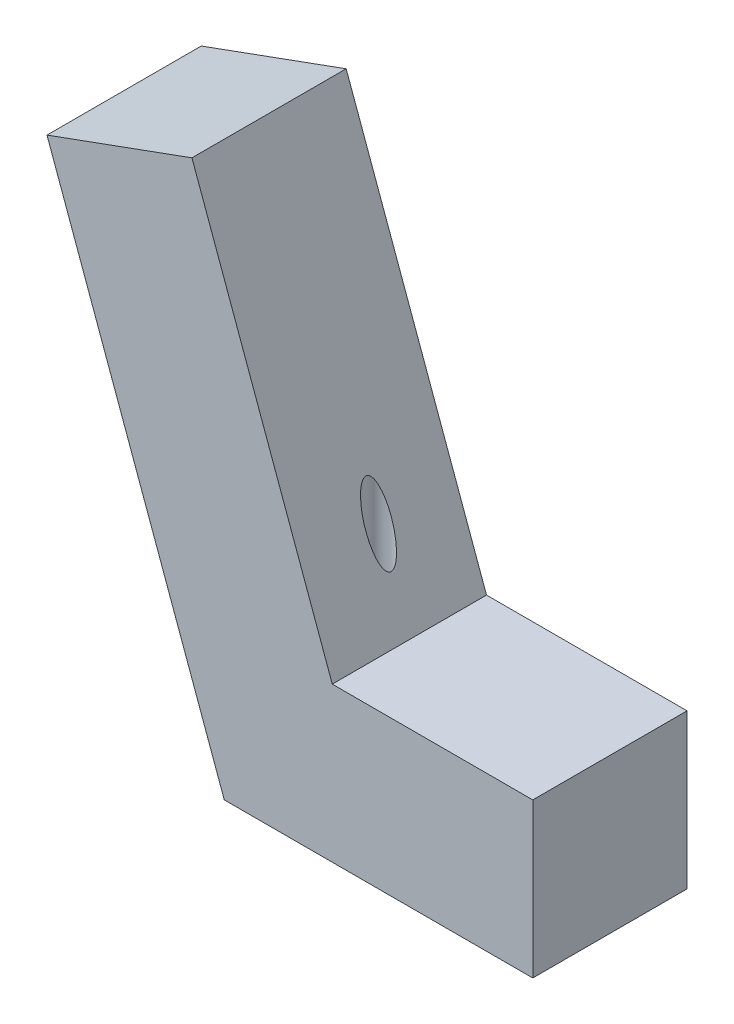
ISO-10303-21;
HEADER;
FILE_DESCRIPTION(('STEP AP214'),'2;1');
FILE_NAME('part.step','',(''),(''),'','','');
FILE_SCHEMA(('AUTOMOTIVE_DESIGN { 1 0 10303 214 1 1 1 1 }'));
ENDSEC;
DATA;
#1=APPLICATION_CONTEXT('core data for automotive mechanical design processes');
#2=APPLICATION_PROTOCOL_DEFINITION('international standard','automotive_design',2000,#1);
#3=PRODUCT_CONTEXT('',#1,'mechanical');
#4=PRODUCT('Part','Part','',(#3));
#5=PRODUCT_RELATED_PRODUCT_CATEGORY('part','',(#4));
#6=PRODUCT_DEFINITION_FORMATION('','',#4);
#7=PRODUCT_DEFINITION_CONTEXT('part definition',#1,'design');
#8=PRODUCT_DEFINITION('design','',#6,#7);
#9=PRODUCT_DEFINITION_SHAPE('','',#8);
#10=(LENGTH_UNIT() NAMED_UNIT(*) SI_UNIT(.MILLI.,.METRE.));
#11=(NAMED_UNIT(*) PLANE_ANGLE_UNIT() SI_UNIT($,.RADIAN.));
#12=(NAMED_UNIT(*) SI_UNIT($,.STERADIAN.) SOLID_ANGLE_UNIT());
#13=UNCERTAINTY_MEASURE_WITH_UNIT(LENGTH_MEASURE(1.E-05),#10,'distance_accuracy_value','');
#14=(GEOMETRIC_REPRESENTATION_CONTEXT(3) GLOBAL_UNCERTAINTY_ASSIGNED_CONTEXT((#13)) GLOBAL_UNIT_ASSIGNED_CONTEXT((#10,
#11,#12)) REPRESENTATION_CONTEXT('',''));
#15=CARTESIAN_POINT('',(0.,0.,0.));
#16=DIRECTION('',(0.,0.,1.));
#17=DIRECTION('',(1.,0.,0.));
#18=AXIS2_PLACEMENT_3D('',#15,#16,#17);
#19=CARTESIAN_POINT('',(60.0448439503615,-25.4,25.4));
#20=DIRECTION('',(0.,1.,0.));
#21=DIRECTION('',(0.,0.,1.));
#22=AXIS2_PLACEMENT_3D('',#19,#20,#21);
#23=PLANE('',#22);
#24=CARTESIAN_POINT('',(21.9448439503615,-25.4,12.7));
#25=DIRECTION('',(0.,-1.,0.));
#26=DIRECTION('',(0.,0.,-1.));
#27=AXIS2_PLACEMENT_3D('',#24,#25,#26);
#28=CIRCLE('',#27,6.35);
#29=CARTESIAN_POINT('',(21.9448439503615,-25.4,6.34999999999999));
#30=VERTEX_POINT('',#29);
#31=EDGE_CURVE('E146',#30,#30,#28,.T.);
#32=ORIENTED_EDGE('',*,*,#31,.F.);
#33=EDGE_LOOP('',(#32));
#34=FACE_BOUND('',#33,.T.);
#35=DIRECTION('',(1.,0.,0.));
#36=VECTOR('',#35,1.);
#37=CARTESIAN_POINT('',(60.0448439503615,-25.4,0.));
#38=LINE('',#37,#36);
#39=CARTESIAN_POINT('',(9.24484395036146,-25.4,0.));
#40=VERTEX_POINT('',#39);
#41=CARTESIAN_POINT('',(60.0448439503615,-25.4,0.));
#42=VERTEX_POINT('',#41);
#43=EDGE_CURVE('E121',#40,#42,#38,.T.);
#44=ORIENTED_EDGE('',*,*,#43,.T.);
#45=DIRECTION('',(0.,0.,-1.));
#46=VECTOR('',#45,1.);
#47=CARTESIAN_POINT('',(60.0448439503615,-25.4,25.4));
#48=LINE('',#47,#46);
#49=CARTESIAN_POINT('',(60.0448439503615,-25.4,25.4));
#50=VERTEX_POINT('',#49);
#51=EDGE_CURVE('E41',#50,#42,#48,.T.);
#52=ORIENTED_EDGE('',*,*,#51,.F.);
#53=DIRECTION('',(1.,0.,0.));
#54=VECTOR('',#53,1.);
#55=CARTESIAN_POINT('',(60.0448439503615,-25.4,25.4));
#56=LINE('',#55,#54);
#57=CARTESIAN_POINT('',(9.24484395036146,-25.4,25.4));
#58=VERTEX_POINT('',#57);
#59=EDGE_CURVE('E87',#58,#50,#56,.T.);
#60=ORIENTED_EDGE('',*,*,#59,.F.);
#61=DIRECTION('',(0.,0.,-1.));
#62=VECTOR('',#61,1.);
#63=CARTESIAN_POINT('',(9.24484395036146,-25.4,25.4));
#64=LINE('',#63,#62);
#65=EDGE_CURVE('E11',#58,#40,#64,.T.);
#66=ORIENTED_EDGE('',*,*,#65,.T.);
#67=EDGE_LOOP('',(#44,#52,#60,#66));
#68=FACE_BOUND('',#67,.T.);
#69=ADVANCED_FACE('F33',(#34,#68),#23,.F.);
#70=CARTESIAN_POINT('',(60.0448439503614,0.,25.4));
#71=DIRECTION('',(-1.,0.,0.));
#72=DIRECTION('',(0.,-1.,0.));
#73=AXIS2_PLACEMENT_3D('',#70,#71,#72);
#74=PLANE('',#73);
#75=DIRECTION('',(0.,1.,0.));
#76=VECTOR('',#75,1.);
#77=CARTESIAN_POINT('',(60.0448439503614,0.,0.));
#78=LINE('',#77,#76);
#79=CARTESIAN_POINT('',(60.0448439503614,0.,0.));
#80=VERTEX_POINT('',#79);
#81=EDGE_CURVE('E123',#42,#80,#78,.T.);
#82=ORIENTED_EDGE('',*,*,#81,.T.);
#83=DIRECTION('',(0.,0.,-1.));
#84=VECTOR('',#83,1.);
#85=CARTESIAN_POINT('',(60.0448439503614,0.,25.4));
#86=LINE('',#85,#84);
#87=CARTESIAN_POINT('',(60.0448439503614,0.,25.4));
#88=VERTEX_POINT('',#87);
#89=EDGE_CURVE('E110',#88,#80,#86,.T.);
#90=ORIENTED_EDGE('',*,*,#89,.F.);
#91=DIRECTION('',(0.,1.,0.));
#92=VECTOR('',#91,1.);
#93=CARTESIAN_POINT('',(60.0448439503614,0.,25.4));
#94=LINE('',#93,#92);
#95=EDGE_CURVE('E101',#50,#88,#94,.T.);
#96=ORIENTED_EDGE('',*,*,#95,.F.);
#97=ORIENTED_EDGE('',*,*,#51,.T.);
#98=EDGE_LOOP('',(#82,#90,#96,#97));
#99=FACE_BOUND('',#98,.T.);
#100=ADVANCED_FACE('F136',(#99),#74,.F.);
#101=CARTESIAN_POINT('',(27.0301154208881,0.,25.4));
#102=DIRECTION('',(0.,-1.,0.));
#103=DIRECTION('',(0.,0.,-1.));
#104=AXIS2_PLACEMENT_3D('',#101,#102,#103);
#105=PLANE('',#104);
#106=DIRECTION('',(-1.,0.,0.));
#107=VECTOR('',#106,1.);
#108=CARTESIAN_POINT('',(27.0301154208881,0.,0.));
#109=LINE('',#108,#107);
#110=CARTESIAN_POINT('',(27.0301154208881,0.,0.));
#111=VERTEX_POINT('',#110);
#112=EDGE_CURVE('E109',#80,#111,#109,.T.);
#113=ORIENTED_EDGE('',*,*,#112,.T.);
#114=DIRECTION('',(0.,0.,-1.));
#115=VECTOR('',#114,1.);
#116=CARTESIAN_POINT('',(27.0301154208881,0.,25.4));
#117=LINE('',#116,#115);
#118=CARTESIAN_POINT('',(27.0301154208881,0.,25.4));
#119=VERTEX_POINT('',#118);
#120=EDGE_CURVE('E106',#119,#111,#117,.T.);
#121=ORIENTED_EDGE('',*,*,#120,.F.);
#122=DIRECTION('',(-1.,0.,0.));
#123=VECTOR('',#122,1.);
#124=CARTESIAN_POINT('',(27.0301154208881,0.,25.4));
#125=LINE('',#124,#123);
#126=EDGE_CURVE('E95',#88,#119,#125,.T.);
#127=ORIENTED_EDGE('',*,*,#126,.F.);
#128=ORIENTED_EDGE('',*,*,#89,.T.);
#129=EDGE_LOOP('',(#113,#121,#127,#128));
#130=FACE_BOUND('',#129,.T.);
#131=ADVANCED_FACE('F107',(#130),#105,.F.);
#132=CARTESIAN_POINT('',(3.91800554498446,63.5,25.4));
#133=DIRECTION('',(-0.939692620785909,-0.342020143325666,0.));
#134=DIRECTION('',(0.342020143325666,-0.939692620785909,0.));
#135=AXIS2_PLACEMENT_3D('',#132,#133,#134);
#136=PLANE('',#135);
#137=CARTESIAN_POINT('',(21.9448439503615,13.9716685370689,12.7));
#138=DIRECTION('',(-0.939692620785909,-0.342020143325666,0.));
#139=DIRECTION('',(0.342020143325666,-0.939692620785909,0.));
#140=AXIS2_PLACEMENT_3D('',#137,#138,#139);
#141=ELLIPSE('',#140,6.12683212054179,2.0955);
#142=CARTESIAN_POINT('',(24.0403439503615,8.21432960460172,12.7));
#143=VERTEX_POINT('',#142);
#144=EDGE_CURVE('E149',#143,#143,#141,.T.);
#145=ORIENTED_EDGE('',*,*,#144,.T.);
#146=EDGE_LOOP('',(#145));
#147=FACE_BOUND('',#146,.T.);
#148=DIRECTION('',(-0.342020143325666,0.939692620785909,0.));
#149=VECTOR('',#148,1.);
#150=CARTESIAN_POINT('',(3.91800554498446,63.5,0.));
#151=LINE('',#150,#149);
#152=CARTESIAN_POINT('',(3.91800554498446,63.5,0.));
#153=VERTEX_POINT('',#152);
#154=EDGE_CURVE('E73',#111,#153,#151,.T.);
#155=ORIENTED_EDGE('',*,*,#154,.T.);
#156=DIRECTION('',(0.,0.,-1.));
#157=VECTOR('',#156,1.);
#158=CARTESIAN_POINT('',(3.91800554498446,63.5,25.4));
#159=LINE('',#158,#157);
#160=CARTESIAN_POINT('',(3.91800554498446,63.5,25.4));
#161=VERTEX_POINT('',#160);
#162=EDGE_CURVE('E111',#161,#153,#159,.T.);
#163=ORIENTED_EDGE('',*,*,#162,.F.);
#164=DIRECTION('',(-0.342020143325666,0.939692620785909,0.));
#165=VECTOR('',#164,1.);
#166=CARTESIAN_POINT('',(3.91800554498446,63.5,25.4));
#167=LINE('',#166,#165);
#168=EDGE_CURVE('E99',#119,#161,#167,.T.);
#169=ORIENTED_EDGE('',*,*,#168,.F.);
#170=ORIENTED_EDGE('',*,*,#120,.T.);
#171=EDGE_LOOP('',(#155,#163,#169,#170));
#172=FACE_BOUND('',#171,.T.);
#173=ADVANCED_FACE('F113',(#147,#172),#136,.F.);
#174=CARTESIAN_POINT('',(-19.9501870229776,54.8126883595281,25.4));
#175=DIRECTION('',(0.342020143325666,-0.939692620785909,0.));
#176=DIRECTION('',(0.939692620785909,0.342020143325666,0.));
#177=AXIS2_PLACEMENT_3D('',#174,#175,#176);
#178=PLANE('',#177);
#179=DIRECTION('',(-0.939692620785909,-0.342020143325666,0.));
#180=VECTOR('',#179,1.);
#181=CARTESIAN_POINT('',(-19.9501870229776,54.8126883595281,0.));
#182=LINE('',#181,#180);
#183=CARTESIAN_POINT('',(-19.9501870229776,54.8126883595281,0.));
#184=VERTEX_POINT('',#183);
#185=EDGE_CURVE('E80',#153,#184,#182,.T.);
#186=ORIENTED_EDGE('',*,*,#185,.T.);
#187=DIRECTION('',(0.,0.,-1.));
#188=VECTOR('',#187,1.);
#189=CARTESIAN_POINT('',(-19.9501870229776,54.8126883595281,25.4));
#190=LINE('',#189,#188);
#191=CARTESIAN_POINT('',(-19.9501870229776,54.8126883595281,25.4));
#192=VERTEX_POINT('',#191);
#193=EDGE_CURVE('E117',#192,#184,#190,.T.);
#194=ORIENTED_EDGE('',*,*,#193,.F.);
#195=DIRECTION('',(-0.939692620785909,-0.342020143325666,0.));
#196=VECTOR('',#195,1.);
#197=CARTESIAN_POINT('',(-19.9501870229776,54.8126883595281,25.4));
#198=LINE('',#197,#196);
#199=EDGE_CURVE('E115',#161,#192,#198,.T.);
#200=ORIENTED_EDGE('',*,*,#199,.F.);
#201=ORIENTED_EDGE('',*,*,#162,.T.);
#202=EDGE_LOOP('',(#186,#194,#200,#201));
#203=FACE_BOUND('',#202,.T.);
#204=ADVANCED_FACE('F142',(#203),#178,.F.);
#205=CARTESIAN_POINT('',(0.,0.,25.4));
#206=DIRECTION('',(0.939692620785909,0.342020143325667,0.));
#207=DIRECTION('',(-0.342020143325667,0.939692620785909,0.));
#208=AXIS2_PLACEMENT_3D('',#205,#206,#207);
#209=PLANE('',#208);
#210=DIRECTION('',(0.342020143325667,-0.939692620785909,0.));
#211=VECTOR('',#210,1.);
#212=CARTESIAN_POINT('',(0.,0.,0.));
#213=LINE('',#212,#211);
#214=EDGE_CURVE('E129',#184,#40,#213,.T.);
#215=ORIENTED_EDGE('',*,*,#214,.T.);
#216=ORIENTED_EDGE('',*,*,#65,.F.);
#217=DIRECTION('',(0.342020143325666,-0.939692620785909,0.));
#218=VECTOR('',#217,1.);
#219=CARTESIAN_POINT('',(9.24484395036146,-25.4,25.4));
#220=LINE('',#219,#218);
#221=EDGE_CURVE('E49',#192,#58,#220,.T.);
#222=ORIENTED_EDGE('',*,*,#221,.F.);
#223=ORIENTED_EDGE('',*,*,#193,.T.);
#224=EDGE_LOOP('',(#215,#216,#222,#223));
#225=FACE_BOUND('',#224,.T.);
#226=ADVANCED_FACE('F141',(#225),#209,.F.);
#227=CARTESIAN_POINT('',(0.,0.,25.4));
#228=DIRECTION('',(0.,0.,-1.));
#229=DIRECTION('',(-1.,0.,0.));
#230=AXIS2_PLACEMENT_3D('',#227,#228,#229);
#231=PLANE('',#230);
#232=ORIENTED_EDGE('',*,*,#221,.T.);
#233=ORIENTED_EDGE('',*,*,#59,.T.);
#234=ORIENTED_EDGE('',*,*,#95,.T.);
#235=ORIENTED_EDGE('',*,*,#126,.T.);
#236=ORIENTED_EDGE('',*,*,#168,.T.);
#237=ORIENTED_EDGE('',*,*,#199,.T.);
#238=EDGE_LOOP('',(#232,#233,#234,#235,#236,#237));
#239=FACE_BOUND('',#238,.T.);
#240=ADVANCED_FACE('F97',(#239),#231,.F.);
#241=CARTESIAN_POINT('',(0.,0.,0.));
#242=DIRECTION('',(0.,0.,-1.));
#243=DIRECTION('',(-1.,0.,0.));
#244=AXIS2_PLACEMENT_3D('',#241,#242,#243);
#245=PLANE('',#244);
#246=ORIENTED_EDGE('',*,*,#43,.F.);
#247=ORIENTED_EDGE('',*,*,#214,.F.);
#248=ORIENTED_EDGE('',*,*,#185,.F.);
#249=ORIENTED_EDGE('',*,*,#154,.F.);
#250=ORIENTED_EDGE('',*,*,#112,.F.);
#251=ORIENTED_EDGE('',*,*,#81,.F.);
#252=EDGE_LOOP('',(#246,#247,#248,#249,#250,#251));
#253=FACE_BOUND('',#252,.T.);
#254=ADVANCED_FACE('F139',(#253),#245,.T.);
#255=CARTESIAN_POINT('',(21.9448439503615,-9.52500000000001,12.7));
#256=DIRECTION('',(0.,-1.,0.));
#257=DIRECTION('',(0.,0.,-1.));
#258=AXIS2_PLACEMENT_3D('',#255,#256,#257);
#259=CYLINDRICAL_SURFACE('',#258,6.35);
#260=CARTESIAN_POINT('',(21.9448439503615,-9.52500000000001,12.7));
#261=DIRECTION('',(0.,-1.,0.));
#262=DIRECTION('',(0.,0.,-1.));
#263=AXIS2_PLACEMENT_3D('',#260,#261,#262);
#264=CIRCLE('',#263,6.35);
#265=CARTESIAN_POINT('',(21.9448439503615,-9.52500000000001,6.34999999999999));
#266=VERTEX_POINT('',#265);
#267=EDGE_CURVE('E124',#266,#266,#264,.T.);
#268=ORIENTED_EDGE('',*,*,#267,.F.);
#269=EDGE_LOOP('',(#268));
#270=FACE_BOUND('',#269,.T.);
#271=ORIENTED_EDGE('',*,*,#31,.T.);
#272=EDGE_LOOP('',(#271));
#273=FACE_BOUND('',#272,.T.);
#274=ADVANCED_FACE('F164',(#270,#273),#259,.F.);
#275=CARTESIAN_POINT('',(21.9448439503615,-9.52500000000001,12.7));
#276=DIRECTION('',(0.,-1.,0.));
#277=DIRECTION('',(0.,0.,-1.));
#278=AXIS2_PLACEMENT_3D('',#275,#276,#277);
#279=PLANE('',#278);
#280=CARTESIAN_POINT('',(21.9448439503615,-9.52500000000001,12.7));
#281=DIRECTION('',(0.,-1.,0.));
#282=DIRECTION('',(0.,0.,-1.));
#283=AXIS2_PLACEMENT_3D('',#280,#281,#282);
#284=CIRCLE('',#283,2.0955);
#285=CARTESIAN_POINT('',(21.9448439503615,-9.52500000000001,10.6045));
#286=VERTEX_POINT('',#285);
#287=EDGE_CURVE('E154',#286,#286,#284,.T.);
#288=ORIENTED_EDGE('',*,*,#287,.F.);
#289=EDGE_LOOP('',(#288));
#290=FACE_BOUND('',#289,.T.);
#291=ORIENTED_EDGE('',*,*,#267,.T.);
#292=EDGE_LOOP('',(#291));
#293=FACE_BOUND('',#292,.T.);
#294=ADVANCED_FACE('F161',(#290,#293),#279,.T.);
#295=CARTESIAN_POINT('',(21.9448439503615,63.5,12.7));
#296=DIRECTION('',(0.,-1.,0.));
#297=DIRECTION('',(0.,0.,-1.));
#298=AXIS2_PLACEMENT_3D('',#295,#296,#297);
#299=CYLINDRICAL_SURFACE('',#298,2.0955);
#300=ORIENTED_EDGE('',*,*,#287,.T.);
#301=EDGE_LOOP('',(#300));
#302=FACE_BOUND('',#301,.T.);
#303=ORIENTED_EDGE('',*,*,#144,.F.);
#304=EDGE_LOOP('',(#303));
#305=FACE_BOUND('',#304,.T.);
#306=ADVANCED_FACE('F158',(#302,#305),#299,.F.);
#307=CLOSED_SHELL('',(#69,#100,#131,#173,#204,#226,#240,#254,#274,#294,#306));
#308=MANIFOLD_SOLID_BREP('B2',#307);
#309=ADVANCED_BREP_SHAPE_REPRESENTATION('',(#18,#308),#14);
#310=SHAPE_DEFINITION_REPRESENTATION(#9,#309);
ENDSEC;
END-ISO-10303-21;
